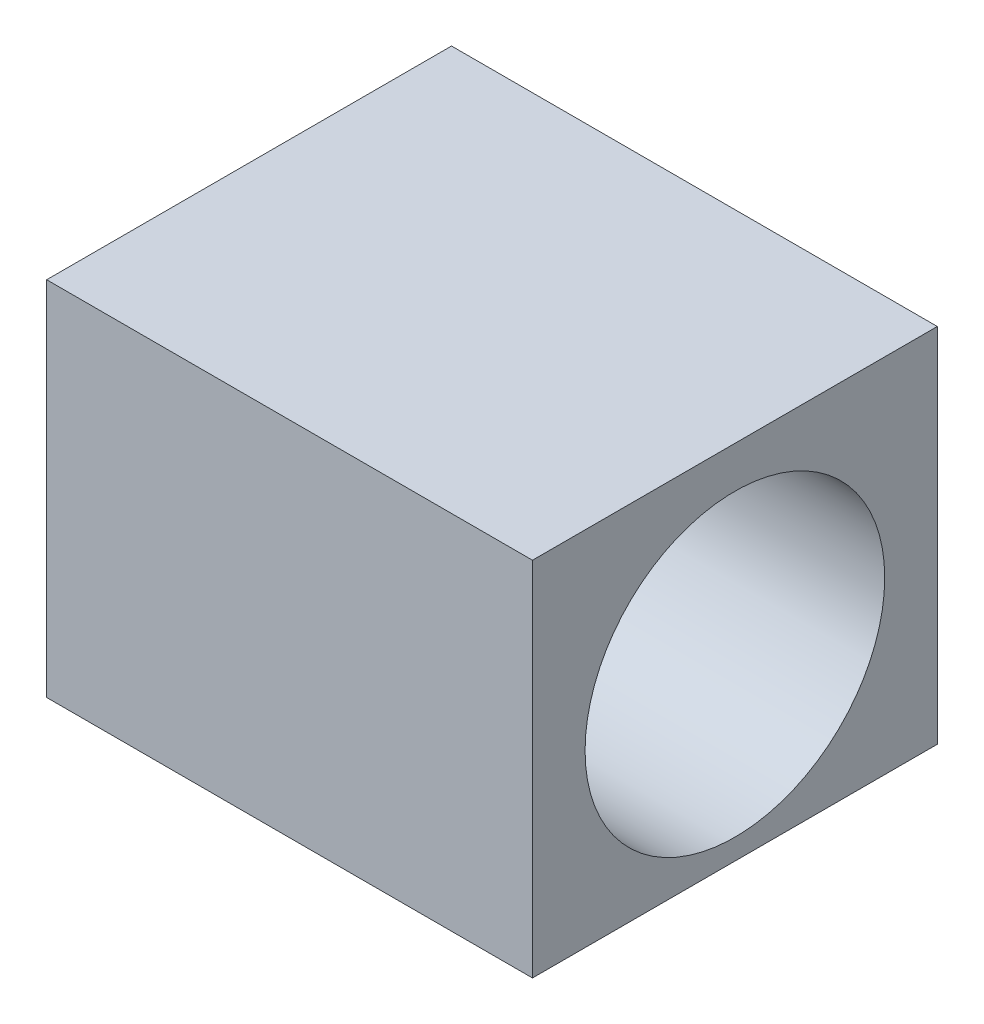
ISO-10303-21;
HEADER;
FILE_DESCRIPTION(('STEP AP214'),'2;1');
FILE_NAME('part.step','',(''),(''),'','','');
FILE_SCHEMA(('AUTOMOTIVE_DESIGN { 1 0 10303 214 1 1 1 1 }'));
ENDSEC;
DATA;
#1=APPLICATION_CONTEXT('core data for automotive mechanical design processes');
#2=APPLICATION_PROTOCOL_DEFINITION('international standard','automotive_design',2000,#1);
#3=PRODUCT_CONTEXT('',#1,'mechanical');
#4=PRODUCT('Part','Part','',(#3));
#5=PRODUCT_RELATED_PRODUCT_CATEGORY('part','',(#4));
#6=PRODUCT_DEFINITION_FORMATION('','',#4);
#7=PRODUCT_DEFINITION_CONTEXT('part definition',#1,'design');
#8=PRODUCT_DEFINITION('design','',#6,#7);
#9=PRODUCT_DEFINITION_SHAPE('','',#8);
#10=(LENGTH_UNIT() NAMED_UNIT(*) SI_UNIT(.MILLI.,.METRE.));
#11=(NAMED_UNIT(*) PLANE_ANGLE_UNIT() SI_UNIT($,.RADIAN.));
#12=(NAMED_UNIT(*) SI_UNIT($,.STERADIAN.) SOLID_ANGLE_UNIT());
#13=UNCERTAINTY_MEASURE_WITH_UNIT(LENGTH_MEASURE(1.E-05),#10,'distance_accuracy_value','');
#14=(GEOMETRIC_REPRESENTATION_CONTEXT(3) GLOBAL_UNCERTAINTY_ASSIGNED_CONTEXT((#13)) GLOBAL_UNIT_ASSIGNED_CONTEXT((#10,
#11,#12)) REPRESENTATION_CONTEXT('',''));
#15=CARTESIAN_POINT('',(0.,0.,0.));
#16=DIRECTION('',(0.,0.,1.));
#17=DIRECTION('',(1.,0.,0.));
#18=AXIS2_PLACEMENT_3D('',#15,#16,#17);
#19=CARTESIAN_POINT('',(0.,-10.4775,0.));
#20=DIRECTION('',(0.,1.,0.));
#21=DIRECTION('',(0.,0.,1.));
#22=AXIS2_PLACEMENT_3D('',#19,#20,#21);
#23=CYLINDRICAL_SURFACE('',#22,4.7625);
#24=CARTESIAN_POINT('',(0.,-1.5875,0.));
#25=DIRECTION('',(0.,1.,0.));
#26=DIRECTION('',(0.,0.,1.));
#27=AXIS2_PLACEMENT_3D('',#24,#25,#26);
#28=CIRCLE('',#27,4.7625);
#29=CARTESIAN_POINT('',(0.,-1.5875,4.7625));
#30=VERTEX_POINT('',#29);
#31=EDGE_CURVE('E86',#30,#30,#28,.F.);
#32=ORIENTED_EDGE('',*,*,#31,.T.);
#33=EDGE_LOOP('',(#32));
#34=FACE_BOUND('',#33,.T.);
#35=CARTESIAN_POINT('',(0.,-6.4135,0.));
#36=DIRECTION('',(0.,-1.,0.));
#37=DIRECTION('',(0.,0.,-1.));
#38=AXIS2_PLACEMENT_3D('',#35,#36,#37);
#39=CIRCLE('',#38,4.7625);
#40=CARTESIAN_POINT('',(0.,-6.4135,-4.7625));
#41=VERTEX_POINT('',#40);
#42=EDGE_CURVE('E44',#41,#41,#39,.T.);
#43=ORIENTED_EDGE('',*,*,#42,.F.);
#44=EDGE_LOOP('',(#43));
#45=FACE_BOUND('',#44,.T.);
#46=ADVANCED_FACE('F35',(#34,#45),#23,.T.);
#47=CARTESIAN_POINT('',(-30.48,40.64,-25.4));
#48=DIRECTION('',(1.,0.,0.));
#49=DIRECTION('',(0.,0.,-1.));
#50=AXIS2_PLACEMENT_3D('',#47,#48,#49);
#51=PLANE('',#50);
#52=CARTESIAN_POINT('',(-30.48,10.9731652217331,8.83883477826688));
#53=DIRECTION('',(-1.,0.,0.));
#54=DIRECTION('',(0.,0.,1.));
#55=AXIS2_PLACEMENT_3D('',#52,#53,#54);
#56=CIRCLE('',#55,2.54);
#57=CARTESIAN_POINT('',(-30.48,10.9731652217331,11.3788347782669));
#58=VERTEX_POINT('',#57);
#59=EDGE_CURVE('E330',#58,#58,#56,.T.);
#60=ORIENTED_EDGE('',*,*,#59,.F.);
#61=EDGE_LOOP('',(#60));
#62=FACE_BOUND('',#61,.T.);
#63=CARTESIAN_POINT('',(-30.48,10.9731652217331,-8.83883477826688));
#64=DIRECTION('',(-1.,0.,0.));
#65=DIRECTION('',(0.,0.,1.));
#66=AXIS2_PLACEMENT_3D('',#63,#64,#65);
#67=CIRCLE('',#66,2.54);
#68=CARTESIAN_POINT('',(-30.48,10.9731652217331,-6.29883477826687));
#69=VERTEX_POINT('',#68);
#70=EDGE_CURVE('E334',#69,#69,#67,.T.);
#71=ORIENTED_EDGE('',*,*,#70,.F.);
#72=EDGE_LOOP('',(#71));
#73=FACE_BOUND('',#72,.T.);
#74=CARTESIAN_POINT('',(-30.48,28.6508347782669,-8.83883477826688));
#75=DIRECTION('',(-1.,0.,0.));
#76=DIRECTION('',(0.,0.,1.));
#77=AXIS2_PLACEMENT_3D('',#74,#75,#76);
#78=CIRCLE('',#77,2.54);
#79=CARTESIAN_POINT('',(-30.48,28.6508347782669,-6.29883477826687));
#80=VERTEX_POINT('',#79);
#81=EDGE_CURVE('E366',#80,#80,#78,.T.);
#82=ORIENTED_EDGE('',*,*,#81,.F.);
#83=EDGE_LOOP('',(#82));
#84=FACE_BOUND('',#83,.T.);
#85=CARTESIAN_POINT('',(-30.48,28.6508347782669,8.83883477826688));
#86=DIRECTION('',(-1.,0.,0.));
#87=DIRECTION('',(0.,0.,1.));
#88=AXIS2_PLACEMENT_3D('',#85,#86,#87);
#89=CIRCLE('',#88,2.54);
#90=CARTESIAN_POINT('',(-30.48,28.6508347782669,11.3788347782669));
#91=VERTEX_POINT('',#90);
#92=EDGE_CURVE('E342',#91,#91,#89,.T.);
#93=ORIENTED_EDGE('',*,*,#92,.F.);
#94=EDGE_LOOP('',(#93));
#95=FACE_BOUND('',#94,.T.);
#96=CARTESIAN_POINT('',(-30.48,32.312000019,0.));
#97=DIRECTION('',(-1.,0.,0.));
#98=DIRECTION('',(0.,0.,1.));
#99=AXIS2_PLACEMENT_3D('',#96,#97,#98);
#100=CIRCLE('',#99,1.5);
#101=CARTESIAN_POINT('',(-30.48,32.312000019,1.5));
#102=VERTEX_POINT('',#101);
#103=EDGE_CURVE('E38',#102,#102,#100,.T.);
#104=ORIENTED_EDGE('',*,*,#103,.F.);
#105=EDGE_LOOP('',(#104));
#106=FACE_BOUND('',#105,.T.);
#107=CARTESIAN_POINT('',(-30.48,7.311999981,0.));
#108=DIRECTION('',(-1.,0.,0.));
#109=DIRECTION('',(0.,0.,1.));
#110=AXIS2_PLACEMENT_3D('',#107,#108,#109);
#111=CIRCLE('',#110,1.5);
#112=CARTESIAN_POINT('',(-30.48,7.311999981,1.5));
#113=VERTEX_POINT('',#112);
#114=EDGE_CURVE('E126',#113,#113,#111,.T.);
#115=ORIENTED_EDGE('',*,*,#114,.F.);
#116=EDGE_LOOP('',(#115));
#117=FACE_BOUND('',#116,.T.);
#118=CARTESIAN_POINT('',(-30.48,19.812,0.));
#119=DIRECTION('',(-1.,0.,0.));
#120=DIRECTION('',(0.,0.,1.));
#121=AXIS2_PLACEMENT_3D('',#118,#119,#120);
#122=CIRCLE('',#121,9.144);
#123=CARTESIAN_POINT('',(-30.48,19.812,9.144));
#124=VERTEX_POINT('',#123);
#125=EDGE_CURVE('E113',#124,#124,#122,.T.);
#126=ORIENTED_EDGE('',*,*,#125,.F.);
#127=EDGE_LOOP('',(#126));
#128=FACE_BOUND('',#127,.T.);
#129=DIRECTION('',(0.,-1.,0.));
#130=VECTOR('',#129,1.);
#131=CARTESIAN_POINT('',(-30.48,40.64,-25.4));
#132=LINE('',#131,#130);
#133=CARTESIAN_POINT('',(-30.48,43.815,-25.4));
#134=VERTEX_POINT('',#133);
#135=CARTESIAN_POINT('',(-30.48,-1.5875,-25.4));
#136=VERTEX_POINT('',#135);
#137=EDGE_CURVE('E53',#134,#136,#132,.T.);
#138=ORIENTED_EDGE('',*,*,#137,.T.);
#139=DIRECTION('',(0.,0.,-1.));
#140=VECTOR('',#139,1.);
#141=CARTESIAN_POINT('',(-30.48,-1.5875,25.4));
#142=LINE('',#141,#140);
#143=CARTESIAN_POINT('',(-30.48,-1.5875,25.4));
#144=VERTEX_POINT('',#143);
#145=EDGE_CURVE('E83',#144,#136,#142,.T.);
#146=ORIENTED_EDGE('',*,*,#145,.F.);
#147=DIRECTION('',(0.,-1.,0.));
#148=VECTOR('',#147,1.);
#149=CARTESIAN_POINT('',(-30.48,40.64,25.4));
#150=LINE('',#149,#148);
#151=CARTESIAN_POINT('',(-30.48,43.815,25.4));
#152=VERTEX_POINT('',#151);
#153=EDGE_CURVE('E74',#152,#144,#150,.T.);
#154=ORIENTED_EDGE('',*,*,#153,.F.);
#155=DIRECTION('',(0.,0.,1.));
#156=VECTOR('',#155,1.);
#157=CARTESIAN_POINT('',(-30.48,43.815,25.4));
#158=LINE('',#157,#156);
#159=EDGE_CURVE('E85',#134,#152,#158,.T.);
#160=ORIENTED_EDGE('',*,*,#159,.F.);
#161=EDGE_LOOP('',(#138,#146,#154,#160));
#162=FACE_BOUND('',#161,.T.);
#163=ADVANCED_FACE('F82',(#62,#73,#84,#95,#106,#117,#128,#162),#51,.F.);
#164=CARTESIAN_POINT('',(-30.48,40.64,25.4));
#165=DIRECTION('',(0.,0.,-1.));
#166=DIRECTION('',(-1.,0.,0.));
#167=AXIS2_PLACEMENT_3D('',#164,#165,#166);
#168=PLANE('',#167);
#169=ORIENTED_EDGE('',*,*,#153,.T.);
#170=DIRECTION('',(-1.,0.,0.));
#171=VECTOR('',#170,1.);
#172=CARTESIAN_POINT('',(30.48,-1.5875,25.4));
#173=LINE('',#172,#171);
#174=CARTESIAN_POINT('',(30.48,-1.5875,25.4));
#175=VERTEX_POINT('',#174);
#176=EDGE_CURVE('E94',#175,#144,#173,.T.);
#177=ORIENTED_EDGE('',*,*,#176,.F.);
#178=DIRECTION('',(0.,-1.,0.));
#179=VECTOR('',#178,1.);
#180=CARTESIAN_POINT('',(30.48,40.64,25.4));
#181=LINE('',#180,#179);
#182=CARTESIAN_POINT('',(30.48,43.815,25.4));
#183=VERTEX_POINT('',#182);
#184=EDGE_CURVE('E70',#183,#175,#181,.T.);
#185=ORIENTED_EDGE('',*,*,#184,.F.);
#186=DIRECTION('',(1.,0.,0.));
#187=VECTOR('',#186,1.);
#188=CARTESIAN_POINT('',(-30.48,43.815,25.4));
#189=LINE('',#188,#187);
#190=EDGE_CURVE('E117',#152,#183,#189,.T.);
#191=ORIENTED_EDGE('',*,*,#190,.F.);
#192=EDGE_LOOP('',(#169,#177,#185,#191));
#193=FACE_BOUND('',#192,.T.);
#194=ADVANCED_FACE('F157',(#193),#168,.F.);
#195=CARTESIAN_POINT('',(30.48,40.64,-25.4));
#196=DIRECTION('',(-1.,0.,0.));
#197=DIRECTION('',(0.,0.,1.));
#198=AXIS2_PLACEMENT_3D('',#195,#196,#197);
#199=PLANE('',#198);
#200=CARTESIAN_POINT('',(30.48,19.812,0.));
#201=DIRECTION('',(1.,0.,0.));
#202=DIRECTION('',(0.,0.,-1.));
#203=AXIS2_PLACEMENT_3D('',#200,#201,#202);
#204=CIRCLE('',#203,18.8);
#205=CARTESIAN_POINT('',(30.48,19.812,-18.8));
#206=VERTEX_POINT('',#205);
#207=EDGE_CURVE('E101',#206,#206,#204,.T.);
#208=ORIENTED_EDGE('',*,*,#207,.F.);
#209=EDGE_LOOP('',(#208));
#210=FACE_BOUND('',#209,.T.);
#211=ORIENTED_EDGE('',*,*,#184,.T.);
#212=DIRECTION('',(0.,0.,1.));
#213=VECTOR('',#212,1.);
#214=CARTESIAN_POINT('',(30.48,-1.5875,25.4));
#215=LINE('',#214,#213);
#216=CARTESIAN_POINT('',(30.48,-1.5875,-25.4));
#217=VERTEX_POINT('',#216);
#218=EDGE_CURVE('E106',#217,#175,#215,.T.);
#219=ORIENTED_EDGE('',*,*,#218,.F.);
#220=DIRECTION('',(0.,-1.,0.));
#221=VECTOR('',#220,1.);
#222=CARTESIAN_POINT('',(30.48,40.64,-25.4));
#223=LINE('',#222,#221);
#224=CARTESIAN_POINT('',(30.48,43.815,-25.4));
#225=VERTEX_POINT('',#224);
#226=EDGE_CURVE('E97',#225,#217,#223,.T.);
#227=ORIENTED_EDGE('',*,*,#226,.F.);
#228=DIRECTION('',(0.,0.,-1.));
#229=VECTOR('',#228,1.);
#230=CARTESIAN_POINT('',(30.48,43.815,25.4));
#231=LINE('',#230,#229);
#232=EDGE_CURVE('E114',#183,#225,#231,.T.);
#233=ORIENTED_EDGE('',*,*,#232,.F.);
#234=EDGE_LOOP('',(#211,#219,#227,#233));
#235=FACE_BOUND('',#234,.T.);
#236=ADVANCED_FACE('F174',(#210,#235),#199,.F.);
#237=CARTESIAN_POINT('',(-30.48,40.64,-25.4));
#238=DIRECTION('',(0.,0.,1.));
#239=DIRECTION('',(1.,0.,0.));
#240=AXIS2_PLACEMENT_3D('',#237,#238,#239);
#241=PLANE('',#240);
#242=ORIENTED_EDGE('',*,*,#226,.T.);
#243=DIRECTION('',(1.,0.,0.));
#244=VECTOR('',#243,1.);
#245=CARTESIAN_POINT('',(30.48,-1.5875,-25.4));
#246=LINE('',#245,#244);
#247=EDGE_CURVE('E92',#136,#217,#246,.T.);
#248=ORIENTED_EDGE('',*,*,#247,.F.);
#249=ORIENTED_EDGE('',*,*,#137,.F.);
#250=DIRECTION('',(-1.,0.,0.));
#251=VECTOR('',#250,1.);
#252=CARTESIAN_POINT('',(-30.48,43.815,-25.4));
#253=LINE('',#252,#251);
#254=EDGE_CURVE('E111',#225,#134,#253,.T.);
#255=ORIENTED_EDGE('',*,*,#254,.F.);
#256=EDGE_LOOP('',(#242,#248,#249,#255));
#257=FACE_BOUND('',#256,.T.);
#258=ADVANCED_FACE('F96',(#257),#241,.F.);
#259=CARTESIAN_POINT('',(0.,-1.5875,0.));
#260=DIRECTION('',(0.,1.,0.));
#261=DIRECTION('',(0.,0.,1.));
#262=AXIS2_PLACEMENT_3D('',#259,#260,#261);
#263=PLANE('',#262);
#264=ORIENTED_EDGE('',*,*,#31,.F.);
#265=EDGE_LOOP('',(#264));
#266=FACE_BOUND('',#265,.T.);
#267=ORIENTED_EDGE('',*,*,#218,.T.);
#268=ORIENTED_EDGE('',*,*,#176,.T.);
#269=ORIENTED_EDGE('',*,*,#145,.T.);
#270=ORIENTED_EDGE('',*,*,#247,.T.);
#271=EDGE_LOOP('',(#267,#268,#269,#270));
#272=FACE_BOUND('',#271,.T.);
#273=ADVANCED_FACE('F91',(#266,#272),#263,.F.);
#274=CARTESIAN_POINT('',(-83.6544299452284,19.812,0.));
#275=DIRECTION('',(1.,0.,0.));
#276=DIRECTION('',(0.,0.,-1.));
#277=AXIS2_PLACEMENT_3D('',#274,#275,#276);
#278=CYLINDRICAL_SURFACE('',#277,18.8);
#279=CARTESIAN_POINT('',(-27.305,19.812,0.));
#280=DIRECTION('',(1.,0.,0.));
#281=DIRECTION('',(0.,0.,-1.));
#282=AXIS2_PLACEMENT_3D('',#279,#280,#281);
#283=CIRCLE('',#282,18.8);
#284=CARTESIAN_POINT('',(-27.305,19.812,-18.8));
#285=VERTEX_POINT('',#284);
#286=EDGE_CURVE('E98',#285,#285,#283,.F.);
#287=CARTESIAN_POINT('',(-27.305,19.812,-18.8));
#288=CARTESIAN_POINT('',(-26.7030729166667,19.812,-18.8));
#289=CARTESIAN_POINT('',(-26.1011458333333,19.812,-18.8));
#290=CARTESIAN_POINT('',(-24.8972916666667,19.812,-18.8));
#291=CARTESIAN_POINT('',(-24.2953645833333,19.812,-18.8));
#292=CARTESIAN_POINT('',(-23.0915104166667,19.812,-18.8));
#293=CARTESIAN_POINT('',(-22.4895833333333,19.812,-18.8));
#294=CARTESIAN_POINT('',(-21.2857291666667,19.812,-18.8));
#295=CARTESIAN_POINT('',(-20.6838020833333,19.812,-18.8));
#296=CARTESIAN_POINT('',(-19.4799479166667,19.812,-18.8));
#297=CARTESIAN_POINT('',(-18.8780208333333,19.812,-18.8));
#298=CARTESIAN_POINT('',(-17.6741666666667,19.812,-18.8));
#299=CARTESIAN_POINT('',(-17.0722395833333,19.812,-18.8));
#300=CARTESIAN_POINT('',(-15.8683854166667,19.812,-18.8));
#301=CARTESIAN_POINT('',(-15.2664583333333,19.812,-18.8));
#302=CARTESIAN_POINT('',(-14.0626041666667,19.812,-18.8));
#303=CARTESIAN_POINT('',(-13.4606770833333,19.812,-18.8));
#304=CARTESIAN_POINT('',(-12.2568229166667,19.812,-18.8));
#305=CARTESIAN_POINT('',(-11.6548958333333,19.812,-18.8));
#306=CARTESIAN_POINT('',(-10.4510416666667,19.812,-18.8));
#307=CARTESIAN_POINT('',(-9.84911458333334,19.812,-18.8));
#308=CARTESIAN_POINT('',(-8.64526041666667,19.812,-18.8));
#309=CARTESIAN_POINT('',(-8.04333333333334,19.812,-18.8));
#310=CARTESIAN_POINT('',(-6.83947916666667,19.812,-18.8));
#311=CARTESIAN_POINT('',(-6.23755208333334,19.812,-18.8));
#312=CARTESIAN_POINT('',(-5.03369791666667,19.812,-18.8));
#313=CARTESIAN_POINT('',(-4.43177083333334,19.812,-18.8));
#314=CARTESIAN_POINT('',(-3.22791666666667,19.812,-18.8));
#315=CARTESIAN_POINT('',(-2.62598958333334,19.812,-18.8));
#316=CARTESIAN_POINT('',(-1.42213541666667,19.812,-18.8));
#317=CARTESIAN_POINT('',(-0.82020833333334,19.812,-18.8));
#318=CARTESIAN_POINT('',(0.383645833333325,19.812,-18.8));
#319=CARTESIAN_POINT('',(0.985572916666658,19.812,-18.8));
#320=CARTESIAN_POINT('',(2.18942708333332,19.812,-18.8));
#321=CARTESIAN_POINT('',(2.79135416666666,19.812,-18.8));
#322=CARTESIAN_POINT('',(3.99520833333332,19.812,-18.8));
#323=CARTESIAN_POINT('',(4.59713541666666,19.812,-18.8));
#324=CARTESIAN_POINT('',(5.80098958333333,19.812,-18.8));
#325=CARTESIAN_POINT('',(6.40291666666667,19.812,-18.8));
#326=CARTESIAN_POINT('',(7.60677083333334,19.812,-18.8));
#327=CARTESIAN_POINT('',(8.20869791666667,19.812,-18.8));
#328=CARTESIAN_POINT('',(9.41255208333334,19.812,-18.8));
#329=CARTESIAN_POINT('',(10.0144791666667,19.812,-18.8));
#330=CARTESIAN_POINT('',(11.2183333333333,19.812,-18.8));
#331=CARTESIAN_POINT('',(11.8202604166667,19.812,-18.8));
#332=CARTESIAN_POINT('',(13.0241145833333,19.812,-18.8));
#333=CARTESIAN_POINT('',(13.6260416666667,19.812,-18.8));
#334=CARTESIAN_POINT('',(14.8298958333333,19.812,-18.8));
#335=CARTESIAN_POINT('',(15.4318229166667,19.812,-18.8));
#336=CARTESIAN_POINT('',(16.6356770833333,19.812,-18.8));
#337=CARTESIAN_POINT('',(17.2376041666667,19.812,-18.8));
#338=CARTESIAN_POINT('',(18.4414583333333,19.812,-18.8));
#339=CARTESIAN_POINT('',(19.0433854166667,19.812,-18.8));
#340=CARTESIAN_POINT('',(20.2472395833333,19.812,-18.8));
#341=CARTESIAN_POINT('',(20.8491666666667,19.812,-18.8));
#342=CARTESIAN_POINT('',(22.0530208333333,19.812,-18.8));
#343=CARTESIAN_POINT('',(22.6549479166667,19.812,-18.8));
#344=CARTESIAN_POINT('',(23.8588020833333,19.812,-18.8));
#345=CARTESIAN_POINT('',(24.4607291666667,19.812,-18.8));
#346=CARTESIAN_POINT('',(25.6645833333333,19.812,-18.8));
#347=CARTESIAN_POINT('',(26.2665104166667,19.812,-18.8));
#348=CARTESIAN_POINT('',(27.4703645833333,19.812,-18.8));
#349=CARTESIAN_POINT('',(28.0722916666667,19.812,-18.8));
#350=CARTESIAN_POINT('',(29.2761458333333,19.812,-18.8));
#351=CARTESIAN_POINT('',(29.8780729166667,19.812,-18.8));
#352=CARTESIAN_POINT('',(30.48,19.812,-18.8));
#353=B_SPLINE_CURVE_WITH_KNOTS('',3,(#287,#288,#289,#290,#291,#292,#293,#294,#295,#296,#297,
#298,#299,#300,#301,#302,#303,#304,#305,#306,#307,#308,#309,#310,#311,#312,#313,#314,#315,#316,
#317,#318,#319,#320,#321,#322,#323,#324,#325,#326,#327,#328,#329,#330,#331,#332,#333,#334,#335,
#336,#337,#338,#339,#340,#341,#342,#343,#344,#345,#346,#347,#348,#349,#350,#351,#352),
.UNSPECIFIED.,.F.,.F.,(4,2,2,2,2,2,2,2,2,2,2,2,2,2,2,2,2,2,2,2,2,2,2,2,2,2,2,2,2,2,2,2,4),(0.,
1.80578125,3.6115625,5.41734375,7.22312499999999,9.02890625,10.8346875,12.64046875,14.44625,
16.25203125,18.0578125,19.86359375,21.669375,23.47515625,25.2809375,27.08671875,28.8925,
30.69828125,32.5040625,34.30984375,36.115625,37.92140625,39.7271875,41.53296875,43.33875,
45.14453125,46.9503125,48.75609375,50.561875,52.36765625,54.1734375,55.97921875,57.785),.UNSPECIFIED.);
#354=EDGE_CURVE('BSEAM188',#285,#206,#353,.T.);
#355=ORIENTED_EDGE('',*,*,#286,.T.);
#356=ORIENTED_EDGE('',*,*,#207,.T.);
#357=ORIENTED_EDGE('',*,*,#354,.T.);
#358=ORIENTED_EDGE('',*,*,#354,.F.);
#359=EDGE_LOOP('',(#355,#357,#356,#358));
#360=FACE_BOUND('',#359,.T.);
#361=ADVANCED_FACE('F188',(#360),#278,.F.);
#362=CARTESIAN_POINT('',(-27.305,40.64,-25.4));
#363=DIRECTION('',(1.,0.,0.));
#364=DIRECTION('',(0.,0.,-1.));
#365=AXIS2_PLACEMENT_3D('',#362,#363,#364);
#366=PLANE('',#365);
#367=CARTESIAN_POINT('',(-27.305,10.9731652217331,8.83883477826688));
#368=DIRECTION('',(1.,0.,0.));
#369=DIRECTION('',(0.,0.,-1.));
#370=AXIS2_PLACEMENT_3D('',#367,#368,#369);
#371=CIRCLE('',#370,2.54);
#372=CARTESIAN_POINT('',(-27.305,10.9731652217331,6.29883477826688));
#373=VERTEX_POINT('',#372);
#374=EDGE_CURVE('E333',#373,#373,#371,.F.);
#375=ORIENTED_EDGE('',*,*,#374,.T.);
#376=EDGE_LOOP('',(#375));
#377=FACE_BOUND('',#376,.T.);
#378=CARTESIAN_POINT('',(-27.305,10.9731652217331,-8.83883477826688));
#379=DIRECTION('',(1.,0.,0.));
#380=DIRECTION('',(0.,0.,-1.));
#381=AXIS2_PLACEMENT_3D('',#378,#379,#380);
#382=CIRCLE('',#381,2.54);
#383=CARTESIAN_POINT('',(-27.305,10.9731652217331,-11.3788347782669));
#384=VERTEX_POINT('',#383);
#385=EDGE_CURVE('E337',#384,#384,#382,.F.);
#386=ORIENTED_EDGE('',*,*,#385,.T.);
#387=EDGE_LOOP('',(#386));
#388=FACE_BOUND('',#387,.T.);
#389=CARTESIAN_POINT('',(-27.305,28.6508347782669,-8.83883477826688));
#390=DIRECTION('',(1.,0.,0.));
#391=DIRECTION('',(0.,0.,-1.));
#392=AXIS2_PLACEMENT_3D('',#389,#390,#391);
#393=CIRCLE('',#392,2.54);
#394=CARTESIAN_POINT('',(-27.305,28.6508347782669,-11.3788347782669));
#395=VERTEX_POINT('',#394);
#396=EDGE_CURVE('E346',#395,#395,#393,.F.);
#397=ORIENTED_EDGE('',*,*,#396,.T.);
#398=EDGE_LOOP('',(#397));
#399=FACE_BOUND('',#398,.T.);
#400=CARTESIAN_POINT('',(-27.305,28.6508347782669,8.83883477826688));
#401=DIRECTION('',(1.,0.,0.));
#402=DIRECTION('',(0.,0.,-1.));
#403=AXIS2_PLACEMENT_3D('',#400,#401,#402);
#404=CIRCLE('',#403,2.54);
#405=CARTESIAN_POINT('',(-27.305,28.6508347782669,6.29883477826688));
#406=VERTEX_POINT('',#405);
#407=EDGE_CURVE('E345',#406,#406,#404,.F.);
#408=ORIENTED_EDGE('',*,*,#407,.T.);
#409=EDGE_LOOP('',(#408));
#410=FACE_BOUND('',#409,.T.);
#411=CARTESIAN_POINT('',(-27.305,32.312000019,0.));
#412=DIRECTION('',(1.,0.,0.));
#413=DIRECTION('',(0.,0.,-1.));
#414=AXIS2_PLACEMENT_3D('',#411,#412,#413);
#415=CIRCLE('',#414,1.5);
#416=CARTESIAN_POINT('',(-27.305,32.312000019,1.5));
#417=VERTEX_POINT('',#416);
#418=EDGE_CURVE('E110',#417,#417,#415,.F.);
#419=ORIENTED_EDGE('',*,*,#418,.T.);
#420=EDGE_LOOP('',(#419));
#421=FACE_BOUND('',#420,.T.);
#422=CARTESIAN_POINT('',(-27.305,7.311999981,0.));
#423=DIRECTION('',(1.,0.,0.));
#424=DIRECTION('',(0.,0.,-1.));
#425=AXIS2_PLACEMENT_3D('',#422,#423,#424);
#426=CIRCLE('',#425,1.5);
#427=CARTESIAN_POINT('',(-27.305,7.311999981,1.5));
#428=VERTEX_POINT('',#427);
#429=EDGE_CURVE('E123',#428,#428,#426,.F.);
#430=ORIENTED_EDGE('',*,*,#429,.T.);
#431=EDGE_LOOP('',(#430));
#432=FACE_BOUND('',#431,.T.);
#433=CARTESIAN_POINT('',(-27.305,19.812,0.));
#434=DIRECTION('',(1.,0.,0.));
#435=DIRECTION('',(0.,0.,-1.));
#436=AXIS2_PLACEMENT_3D('',#433,#434,#435);
#437=CIRCLE('',#436,9.144);
#438=CARTESIAN_POINT('',(-27.305,19.812,-9.144));
#439=VERTEX_POINT('',#438);
#440=EDGE_CURVE('E120',#439,#439,#437,.F.);
#441=ORIENTED_EDGE('',*,*,#440,.T.);
#442=EDGE_LOOP('',(#441));
#443=FACE_BOUND('',#442,.T.);
#444=ORIENTED_EDGE('',*,*,#286,.F.);
#445=EDGE_LOOP('',(#444));
#446=FACE_BOUND('',#445,.T.);
#447=ADVANCED_FACE('F133',(#377,#388,#399,#410,#421,#432,#443,#446),#366,.T.);
#448=CARTESIAN_POINT('',(0.,43.815,0.));
#449=DIRECTION('',(0.,-1.,0.));
#450=DIRECTION('',(0.,0.,-1.));
#451=AXIS2_PLACEMENT_3D('',#448,#449,#450);
#452=PLANE('',#451);
#453=ORIENTED_EDGE('',*,*,#159,.T.);
#454=ORIENTED_EDGE('',*,*,#190,.T.);
#455=ORIENTED_EDGE('',*,*,#232,.T.);
#456=ORIENTED_EDGE('',*,*,#254,.T.);
#457=EDGE_LOOP('',(#453,#454,#455,#456));
#458=FACE_BOUND('',#457,.T.);
#459=ADVANCED_FACE('F195',(#458),#452,.F.);
#460=CARTESIAN_POINT('',(-1.44186237132084,19.812,0.));
#461=DIRECTION('',(-1.,0.,0.));
#462=DIRECTION('',(0.,0.,1.));
#463=AXIS2_PLACEMENT_3D('',#460,#461,#462);
#464=CYLINDRICAL_SURFACE('',#463,9.144);
#465=ORIENTED_EDGE('',*,*,#125,.T.);
#466=EDGE_LOOP('',(#465));
#467=FACE_BOUND('',#466,.T.);
#468=ORIENTED_EDGE('',*,*,#440,.F.);
#469=EDGE_LOOP('',(#468));
#470=FACE_BOUND('',#469,.T.);
#471=ADVANCED_FACE('F148',(#467,#470),#464,.F.);
#472=CARTESIAN_POINT('',(-23.0623593128807,7.311999981,0.));
#473=DIRECTION('',(-1.,0.,0.));
#474=DIRECTION('',(0.,0.,1.));
#475=AXIS2_PLACEMENT_3D('',#472,#473,#474);
#476=CYLINDRICAL_SURFACE('',#475,1.5);
#477=CARTESIAN_POINT('',(-30.48,7.311999981,1.5));
#478=CARTESIAN_POINT('',(-30.4469270833333,7.311999981,1.5));
#479=CARTESIAN_POINT('',(-30.4138541666667,7.311999981,1.5));
#480=CARTESIAN_POINT('',(-30.3477083333333,7.311999981,1.5));
#481=CARTESIAN_POINT('',(-30.3146354166667,7.311999981,1.5));
#482=CARTESIAN_POINT('',(-30.2484895833333,7.311999981,1.5));
#483=CARTESIAN_POINT('',(-30.2154166666667,7.311999981,1.5));
#484=CARTESIAN_POINT('',(-30.1492708333333,7.311999981,1.5));
#485=CARTESIAN_POINT('',(-30.1161979166667,7.311999981,1.5));
#486=CARTESIAN_POINT('',(-30.0500520833333,7.311999981,1.5));
#487=CARTESIAN_POINT('',(-30.0169791666667,7.311999981,1.5));
#488=CARTESIAN_POINT('',(-29.9508333333333,7.311999981,1.5));
#489=CARTESIAN_POINT('',(-29.9177604166667,7.311999981,1.5));
#490=CARTESIAN_POINT('',(-29.8516145833333,7.311999981,1.5));
#491=CARTESIAN_POINT('',(-29.8185416666667,7.311999981,1.5));
#492=CARTESIAN_POINT('',(-29.7523958333333,7.311999981,1.5));
#493=CARTESIAN_POINT('',(-29.7193229166667,7.311999981,1.5));
#494=CARTESIAN_POINT('',(-29.6531770833333,7.311999981,1.5));
#495=CARTESIAN_POINT('',(-29.6201041666667,7.311999981,1.5));
#496=CARTESIAN_POINT('',(-29.5539583333333,7.311999981,1.5));
#497=CARTESIAN_POINT('',(-29.5208854166667,7.311999981,1.5));
#498=CARTESIAN_POINT('',(-29.4547395833333,7.311999981,1.5));
#499=CARTESIAN_POINT('',(-29.4216666666667,7.311999981,1.5));
#500=CARTESIAN_POINT('',(-29.3555208333333,7.311999981,1.5));
#501=CARTESIAN_POINT('',(-29.3224479166667,7.311999981,1.5));
#502=CARTESIAN_POINT('',(-29.2563020833333,7.311999981,1.5));
#503=CARTESIAN_POINT('',(-29.2232291666667,7.311999981,1.5));
#504=CARTESIAN_POINT('',(-29.1570833333333,7.311999981,1.5));
#505=CARTESIAN_POINT('',(-29.1240104166667,7.311999981,1.5));
#506=CARTESIAN_POINT('',(-29.0578645833333,7.311999981,1.5));
#507=CARTESIAN_POINT('',(-29.0247916666667,7.311999981,1.5));
#508=CARTESIAN_POINT('',(-28.9586458333333,7.311999981,1.5));
#509=CARTESIAN_POINT('',(-28.9255729166667,7.311999981,1.5));
#510=CARTESIAN_POINT('',(-28.8594270833333,7.311999981,1.5));
#511=CARTESIAN_POINT('',(-28.8263541666667,7.311999981,1.5));
#512=CARTESIAN_POINT('',(-28.7602083333333,7.311999981,1.5));
#513=CARTESIAN_POINT('',(-28.7271354166667,7.311999981,1.5));
#514=CARTESIAN_POINT('',(-28.6609895833333,7.311999981,1.5));
#515=CARTESIAN_POINT('',(-28.6279166666667,7.311999981,1.5));
#516=CARTESIAN_POINT('',(-28.5617708333333,7.311999981,1.5));
#517=CARTESIAN_POINT('',(-28.5286979166667,7.311999981,1.5));
#518=CARTESIAN_POINT('',(-28.4625520833333,7.311999981,1.5));
#519=CARTESIAN_POINT('',(-28.4294791666667,7.311999981,1.5));
#520=CARTESIAN_POINT('',(-28.3633333333333,7.311999981,1.5));
#521=CARTESIAN_POINT('',(-28.3302604166667,7.311999981,1.5));
#522=CARTESIAN_POINT('',(-28.2641145833333,7.311999981,1.5));
#523=CARTESIAN_POINT('',(-28.2310416666667,7.311999981,1.5));
#524=CARTESIAN_POINT('',(-28.1648958333333,7.311999981,1.5));
#525=CARTESIAN_POINT('',(-28.1318229166667,7.311999981,1.5));
#526=CARTESIAN_POINT('',(-28.0656770833333,7.311999981,1.5));
#527=CARTESIAN_POINT('',(-28.0326041666667,7.311999981,1.5));
#528=CARTESIAN_POINT('',(-27.9664583333333,7.311999981,1.5));
#529=CARTESIAN_POINT('',(-27.9333854166667,7.311999981,1.5));
#530=CARTESIAN_POINT('',(-27.8672395833333,7.311999981,1.5));
#531=CARTESIAN_POINT('',(-27.8341666666667,7.311999981,1.5));
#532=CARTESIAN_POINT('',(-27.7680208333333,7.311999981,1.5));
#533=CARTESIAN_POINT('',(-27.7349479166667,7.311999981,1.5));
#534=CARTESIAN_POINT('',(-27.6688020833333,7.311999981,1.5));
#535=CARTESIAN_POINT('',(-27.6357291666667,7.311999981,1.5));
#536=CARTESIAN_POINT('',(-27.5695833333333,7.311999981,1.5));
#537=CARTESIAN_POINT('',(-27.5365104166667,7.311999981,1.5));
#538=CARTESIAN_POINT('',(-27.4703645833333,7.311999981,1.5));
#539=CARTESIAN_POINT('',(-27.4372916666667,7.311999981,1.5));
#540=CARTESIAN_POINT('',(-27.3711458333333,7.311999981,1.5));
#541=CARTESIAN_POINT('',(-27.3380729166667,7.311999981,1.5));
#542=CARTESIAN_POINT('',(-27.305,7.311999981,1.5));
#543=B_SPLINE_CURVE_WITH_KNOTS('',3,(#477,#478,#479,#480,#481,#482,#483,#484,#485,#486,#487,
#488,#489,#490,#491,#492,#493,#494,#495,#496,#497,#498,#499,#500,#501,#502,#503,#504,#505,#506,
#507,#508,#509,#510,#511,#512,#513,#514,#515,#516,#517,#518,#519,#520,#521,#522,#523,#524,#525,
#526,#527,#528,#529,#530,#531,#532,#533,#534,#535,#536,#537,#538,#539,#540,#541,#542),
.UNSPECIFIED.,.F.,.F.,(4,2,2,2,2,2,2,2,2,2,2,2,2,2,2,2,2,2,2,2,2,2,2,2,2,2,2,2,2,2,2,2,4),(0.,
0.0992187500000012,0.198437499999999,0.29765625,0.396875000000001,0.496093749999999,0.5953125,
0.694531250000002,0.793749999999999,0.892968750000001,0.992187500000002,1.09140625,1.190625,
1.28984375,1.3890625,1.48828125,1.5875,1.68671875,1.7859375,1.88515625,1.984375,2.08359375,
2.1828125,2.28203125,2.38125,2.48046875,2.5796875,2.67890625,2.778125,2.87734375,2.9765625,
3.07578125,3.175),.UNSPECIFIED.);
#544=EDGE_CURVE('BSEAM139',#113,#428,#543,.T.);
#545=ORIENTED_EDGE('',*,*,#114,.T.);
#546=ORIENTED_EDGE('',*,*,#429,.F.);
#547=ORIENTED_EDGE('',*,*,#544,.T.);
#548=ORIENTED_EDGE('',*,*,#544,.F.);
#549=EDGE_LOOP('',(#545,#547,#546,#548));
#550=FACE_BOUND('',#549,.T.);
#551=ADVANCED_FACE('F139',(#550),#476,.F.);
#552=CARTESIAN_POINT('',(-23.0623593128807,32.312000019,0.));
#553=DIRECTION('',(-1.,0.,0.));
#554=DIRECTION('',(0.,0.,1.));
#555=AXIS2_PLACEMENT_3D('',#552,#553,#554);
#556=CYLINDRICAL_SURFACE('',#555,1.5);
#557=CARTESIAN_POINT('',(-30.48,32.312000019,1.5));
#558=CARTESIAN_POINT('',(-30.4469270833333,32.312000019,1.5));
#559=CARTESIAN_POINT('',(-30.4138541666667,32.312000019,1.5));
#560=CARTESIAN_POINT('',(-30.3477083333333,32.312000019,1.5));
#561=CARTESIAN_POINT('',(-30.3146354166667,32.312000019,1.5));
#562=CARTESIAN_POINT('',(-30.2484895833333,32.312000019,1.5));
#563=CARTESIAN_POINT('',(-30.2154166666667,32.312000019,1.5));
#564=CARTESIAN_POINT('',(-30.1492708333333,32.312000019,1.5));
#565=CARTESIAN_POINT('',(-30.1161979166667,32.312000019,1.5));
#566=CARTESIAN_POINT('',(-30.0500520833333,32.312000019,1.5));
#567=CARTESIAN_POINT('',(-30.0169791666667,32.312000019,1.5));
#568=CARTESIAN_POINT('',(-29.9508333333333,32.312000019,1.5));
#569=CARTESIAN_POINT('',(-29.9177604166667,32.312000019,1.5));
#570=CARTESIAN_POINT('',(-29.8516145833333,32.312000019,1.5));
#571=CARTESIAN_POINT('',(-29.8185416666667,32.312000019,1.5));
#572=CARTESIAN_POINT('',(-29.7523958333333,32.312000019,1.5));
#573=CARTESIAN_POINT('',(-29.7193229166667,32.312000019,1.5));
#574=CARTESIAN_POINT('',(-29.6531770833333,32.312000019,1.5));
#575=CARTESIAN_POINT('',(-29.6201041666667,32.312000019,1.5));
#576=CARTESIAN_POINT('',(-29.5539583333333,32.312000019,1.5));
#577=CARTESIAN_POINT('',(-29.5208854166667,32.312000019,1.5));
#578=CARTESIAN_POINT('',(-29.4547395833333,32.312000019,1.5));
#579=CARTESIAN_POINT('',(-29.4216666666667,32.312000019,1.5));
#580=CARTESIAN_POINT('',(-29.3555208333333,32.312000019,1.5));
#581=CARTESIAN_POINT('',(-29.3224479166667,32.312000019,1.5));
#582=CARTESIAN_POINT('',(-29.2563020833333,32.312000019,1.5));
#583=CARTESIAN_POINT('',(-29.2232291666667,32.312000019,1.5));
#584=CARTESIAN_POINT('',(-29.1570833333333,32.312000019,1.5));
#585=CARTESIAN_POINT('',(-29.1240104166667,32.312000019,1.5));
#586=CARTESIAN_POINT('',(-29.0578645833333,32.312000019,1.5));
#587=CARTESIAN_POINT('',(-29.0247916666667,32.312000019,1.5));
#588=CARTESIAN_POINT('',(-28.9586458333333,32.312000019,1.5));
#589=CARTESIAN_POINT('',(-28.9255729166667,32.312000019,1.5));
#590=CARTESIAN_POINT('',(-28.8594270833333,32.312000019,1.5));
#591=CARTESIAN_POINT('',(-28.8263541666667,32.312000019,1.5));
#592=CARTESIAN_POINT('',(-28.7602083333333,32.312000019,1.5));
#593=CARTESIAN_POINT('',(-28.7271354166667,32.312000019,1.5));
#594=CARTESIAN_POINT('',(-28.6609895833333,32.312000019,1.5));
#595=CARTESIAN_POINT('',(-28.6279166666667,32.312000019,1.5));
#596=CARTESIAN_POINT('',(-28.5617708333333,32.312000019,1.5));
#597=CARTESIAN_POINT('',(-28.5286979166667,32.312000019,1.5));
#598=CARTESIAN_POINT('',(-28.4625520833333,32.312000019,1.5));
#599=CARTESIAN_POINT('',(-28.4294791666667,32.312000019,1.5));
#600=CARTESIAN_POINT('',(-28.3633333333333,32.312000019,1.5));
#601=CARTESIAN_POINT('',(-28.3302604166667,32.312000019,1.5));
#602=CARTESIAN_POINT('',(-28.2641145833333,32.312000019,1.5));
#603=CARTESIAN_POINT('',(-28.2310416666667,32.312000019,1.5));
#604=CARTESIAN_POINT('',(-28.1648958333333,32.312000019,1.5));
#605=CARTESIAN_POINT('',(-28.1318229166667,32.312000019,1.5));
#606=CARTESIAN_POINT('',(-28.0656770833333,32.312000019,1.5));
#607=CARTESIAN_POINT('',(-28.0326041666667,32.312000019,1.5));
#608=CARTESIAN_POINT('',(-27.9664583333333,32.312000019,1.5));
#609=CARTESIAN_POINT('',(-27.9333854166667,32.312000019,1.5));
#610=CARTESIAN_POINT('',(-27.8672395833333,32.312000019,1.5));
#611=CARTESIAN_POINT('',(-27.8341666666667,32.312000019,1.5));
#612=CARTESIAN_POINT('',(-27.7680208333333,32.312000019,1.5));
#613=CARTESIAN_POINT('',(-27.7349479166667,32.312000019,1.5));
#614=CARTESIAN_POINT('',(-27.6688020833333,32.312000019,1.5));
#615=CARTESIAN_POINT('',(-27.6357291666667,32.312000019,1.5));
#616=CARTESIAN_POINT('',(-27.5695833333333,32.312000019,1.5));
#617=CARTESIAN_POINT('',(-27.5365104166667,32.312000019,1.5));
#618=CARTESIAN_POINT('',(-27.4703645833333,32.312000019,1.5));
#619=CARTESIAN_POINT('',(-27.4372916666667,32.312000019,1.5));
#620=CARTESIAN_POINT('',(-27.3711458333333,32.312000019,1.5));
#621=CARTESIAN_POINT('',(-27.3380729166667,32.312000019,1.5));
#622=CARTESIAN_POINT('',(-27.305,32.312000019,1.5));
#623=B_SPLINE_CURVE_WITH_KNOTS('',3,(#557,#558,#559,#560,#561,#562,#563,#564,#565,#566,#567,
#568,#569,#570,#571,#572,#573,#574,#575,#576,#577,#578,#579,#580,#581,#582,#583,#584,#585,#586,
#587,#588,#589,#590,#591,#592,#593,#594,#595,#596,#597,#598,#599,#600,#601,#602,#603,#604,#605,
#606,#607,#608,#609,#610,#611,#612,#613,#614,#615,#616,#617,#618,#619,#620,#621,#622),
.UNSPECIFIED.,.F.,.F.,(4,2,2,2,2,2,2,2,2,2,2,2,2,2,2,2,2,2,2,2,2,2,2,2,2,2,2,2,2,2,2,2,4),(0.,
0.0992187500000012,0.198437499999999,0.29765625,0.396875000000001,0.496093749999999,0.5953125,
0.694531250000002,0.793749999999999,0.892968750000001,0.992187500000002,1.09140625,1.190625,
1.28984375,1.3890625,1.48828125,1.5875,1.68671875,1.7859375,1.88515625,1.984375,2.08359375,
2.1828125,2.28203125,2.38125,2.48046875,2.5796875,2.67890625,2.778125,2.87734375,2.9765625,
3.07578125,3.175),.UNSPECIFIED.);
#624=EDGE_CURVE('BSEAM136',#102,#417,#623,.T.);
#625=ORIENTED_EDGE('',*,*,#103,.T.);
#626=ORIENTED_EDGE('',*,*,#418,.F.);
#627=ORIENTED_EDGE('',*,*,#624,.T.);
#628=ORIENTED_EDGE('',*,*,#624,.F.);
#629=EDGE_LOOP('',(#625,#627,#626,#628));
#630=FACE_BOUND('',#629,.T.);
#631=ADVANCED_FACE('F136',(#630),#556,.F.);
#632=CARTESIAN_POINT('',(0.,-6.4135,0.));
#633=DIRECTION('',(0.,-1.,0.));
#634=DIRECTION('',(0.,0.,-1.));
#635=AXIS2_PLACEMENT_3D('',#632,#633,#634);
#636=PLANE('',#635);
#637=CARTESIAN_POINT('',(0.,-6.4135,0.));
#638=DIRECTION('',(0.,-1.,0.));
#639=DIRECTION('',(0.,0.,-1.));
#640=AXIS2_PLACEMENT_3D('',#637,#638,#639);
#641=CIRCLE('',#640,4.4704);
#642=CARTESIAN_POINT('',(0.,-6.4135,-4.4704));
#643=VERTEX_POINT('',#642);
#644=EDGE_CURVE('E12',#643,#643,#641,.T.);
#645=ORIENTED_EDGE('',*,*,#644,.F.);
#646=EDGE_LOOP('',(#645));
#647=FACE_BOUND('',#646,.T.);
#648=ORIENTED_EDGE('',*,*,#42,.T.);
#649=EDGE_LOOP('',(#648));
#650=FACE_BOUND('',#649,.T.);
#651=ADVANCED_FACE('F138',(#647,#650),#636,.T.);
#652=CARTESIAN_POINT('',(0.,-19.7943006184654,0.));
#653=DIRECTION('',(0.,1.,0.));
#654=DIRECTION('',(0.,0.,1.));
#655=AXIS2_PLACEMENT_3D('',#652,#653,#654);
#656=CYLINDRICAL_SURFACE('',#655,4.4704);
#657=ORIENTED_EDGE('',*,*,#644,.T.);
#658=EDGE_LOOP('',(#657));
#659=FACE_BOUND('',#658,.T.);
#660=CARTESIAN_POINT('',(0.,-7.1501,0.));
#661=DIRECTION('',(0.,-1.,0.));
#662=DIRECTION('',(0.,0.,-1.));
#663=AXIS2_PLACEMENT_3D('',#660,#661,#662);
#664=CIRCLE('',#663,4.4704);
#665=CARTESIAN_POINT('',(0.,-7.1501,-4.4704));
#666=VERTEX_POINT('',#665);
#667=EDGE_CURVE('E169',#666,#666,#664,.T.);
#668=ORIENTED_EDGE('',*,*,#667,.F.);
#669=EDGE_LOOP('',(#668));
#670=FACE_BOUND('',#669,.T.);
#671=ADVANCED_FACE('F146',(#659,#670),#656,.T.);
#672=CARTESIAN_POINT('',(0.,-10.4775,0.));
#673=DIRECTION('',(0.,-1.,0.));
#674=DIRECTION('',(0.,0.,-1.));
#675=AXIS2_PLACEMENT_3D('',#672,#673,#674);
#676=PLANE('',#675);
#677=CARTESIAN_POINT('',(0.,-10.4775,0.));
#678=DIRECTION('',(0.,-1.,0.));
#679=DIRECTION('',(0.,0.,-1.));
#680=AXIS2_PLACEMENT_3D('',#677,#678,#679);
#681=CIRCLE('',#680,4.7625);
#682=CARTESIAN_POINT('',(0.,-10.4775,-4.7625));
#683=VERTEX_POINT('',#682);
#684=EDGE_CURVE('E350',#683,#683,#681,.T.);
#685=ORIENTED_EDGE('',*,*,#684,.T.);
#686=EDGE_LOOP('',(#685));
#687=FACE_BOUND('',#686,.T.);
#688=ADVANCED_FACE('F239',(#687),#676,.T.);
#689=CARTESIAN_POINT('',(0.,-10.4775,0.));
#690=DIRECTION('',(0.,1.,0.));
#691=DIRECTION('',(0.,0.,1.));
#692=AXIS2_PLACEMENT_3D('',#689,#690,#691);
#693=CYLINDRICAL_SURFACE('',#692,4.7625);
#694=CARTESIAN_POINT('',(0.,-7.1501,0.));
#695=DIRECTION('',(0.,-1.,0.));
#696=DIRECTION('',(0.,0.,-1.));
#697=AXIS2_PLACEMENT_3D('',#694,#695,#696);
#698=CIRCLE('',#697,4.7625);
#699=CARTESIAN_POINT('',(0.,-7.1501,-4.7625));
#700=VERTEX_POINT('',#699);
#701=EDGE_CURVE('E349',#700,#700,#698,.T.);
#702=ORIENTED_EDGE('',*,*,#701,.T.);
#703=EDGE_LOOP('',(#702));
#704=FACE_BOUND('',#703,.T.);
#705=ORIENTED_EDGE('',*,*,#684,.F.);
#706=EDGE_LOOP('',(#705));
#707=FACE_BOUND('',#706,.T.);
#708=ADVANCED_FACE('F249',(#704,#707),#693,.T.);
#709=CARTESIAN_POINT('',(0.,-7.1501,0.));
#710=DIRECTION('',(0.,-1.,0.));
#711=DIRECTION('',(0.,0.,-1.));
#712=AXIS2_PLACEMENT_3D('',#709,#710,#711);
#713=PLANE('',#712);
#714=ORIENTED_EDGE('',*,*,#667,.T.);
#715=EDGE_LOOP('',(#714));
#716=FACE_BOUND('',#715,.T.);
#717=ORIENTED_EDGE('',*,*,#701,.F.);
#718=EDGE_LOOP('',(#717));
#719=FACE_BOUND('',#718,.T.);
#720=ADVANCED_FACE('F259',(#716,#719),#713,.F.);
#721=CARTESIAN_POINT('',(-20.1207951031447,28.6508347782669,8.83883477826688));
#722=DIRECTION('',(-1.,0.,0.));
#723=DIRECTION('',(0.,0.,1.));
#724=AXIS2_PLACEMENT_3D('',#721,#722,#723);
#725=CYLINDRICAL_SURFACE('',#724,2.54);
#726=ORIENTED_EDGE('',*,*,#92,.T.);
#727=EDGE_LOOP('',(#726));
#728=FACE_BOUND('',#727,.T.);
#729=ORIENTED_EDGE('',*,*,#407,.F.);
#730=EDGE_LOOP('',(#729));
#731=FACE_BOUND('',#730,.T.);
#732=ADVANCED_FACE('F268',(#728,#731),#725,.F.);
#733=CARTESIAN_POINT('',(-20.1207951031447,28.6508347782669,-8.83883477826688));
#734=DIRECTION('',(-1.,0.,0.));
#735=DIRECTION('',(0.,0.,1.));
#736=AXIS2_PLACEMENT_3D('',#733,#734,#735);
#737=CYLINDRICAL_SURFACE('',#736,2.54);
#738=ORIENTED_EDGE('',*,*,#81,.T.);
#739=EDGE_LOOP('',(#738));
#740=FACE_BOUND('',#739,.T.);
#741=ORIENTED_EDGE('',*,*,#396,.F.);
#742=EDGE_LOOP('',(#741));
#743=FACE_BOUND('',#742,.T.);
#744=ADVANCED_FACE('F293',(#740,#743),#737,.F.);
#745=CARTESIAN_POINT('',(-20.1207951031447,10.9731652217331,-8.83883477826688));
#746=DIRECTION('',(-1.,0.,0.));
#747=DIRECTION('',(0.,0.,1.));
#748=AXIS2_PLACEMENT_3D('',#745,#746,#747);
#749=CYLINDRICAL_SURFACE('',#748,2.54);
#750=ORIENTED_EDGE('',*,*,#70,.T.);
#751=EDGE_LOOP('',(#750));
#752=FACE_BOUND('',#751,.T.);
#753=ORIENTED_EDGE('',*,*,#385,.F.);
#754=EDGE_LOOP('',(#753));
#755=FACE_BOUND('',#754,.T.);
#756=ADVANCED_FACE('F303',(#752,#755),#749,.F.);
#757=CARTESIAN_POINT('',(-20.1207951031447,10.9731652217331,8.83883477826688));
#758=DIRECTION('',(-1.,0.,0.));
#759=DIRECTION('',(0.,0.,1.));
#760=AXIS2_PLACEMENT_3D('',#757,#758,#759);
#761=CYLINDRICAL_SURFACE('',#760,2.54);
#762=ORIENTED_EDGE('',*,*,#59,.T.);
#763=EDGE_LOOP('',(#762));
#764=FACE_BOUND('',#763,.T.);
#765=ORIENTED_EDGE('',*,*,#374,.F.);
#766=EDGE_LOOP('',(#765));
#767=FACE_BOUND('',#766,.T.);
#768=ADVANCED_FACE('F313',(#764,#767),#761,.F.);
#769=CLOSED_SHELL('',(#46,#163,#194,#236,#258,#273,#361,#447,#459,#471,#551,#631,#651,#671,#688,
#708,#720,#732,#744,#756,#768));
#770=MANIFOLD_SOLID_BREP('B2',#769);
#771=ADVANCED_BREP_SHAPE_REPRESENTATION('',(#18,#770),#14);
#772=SHAPE_DEFINITION_REPRESENTATION(#9,#771);
ENDSEC;
END-ISO-10303-21;
